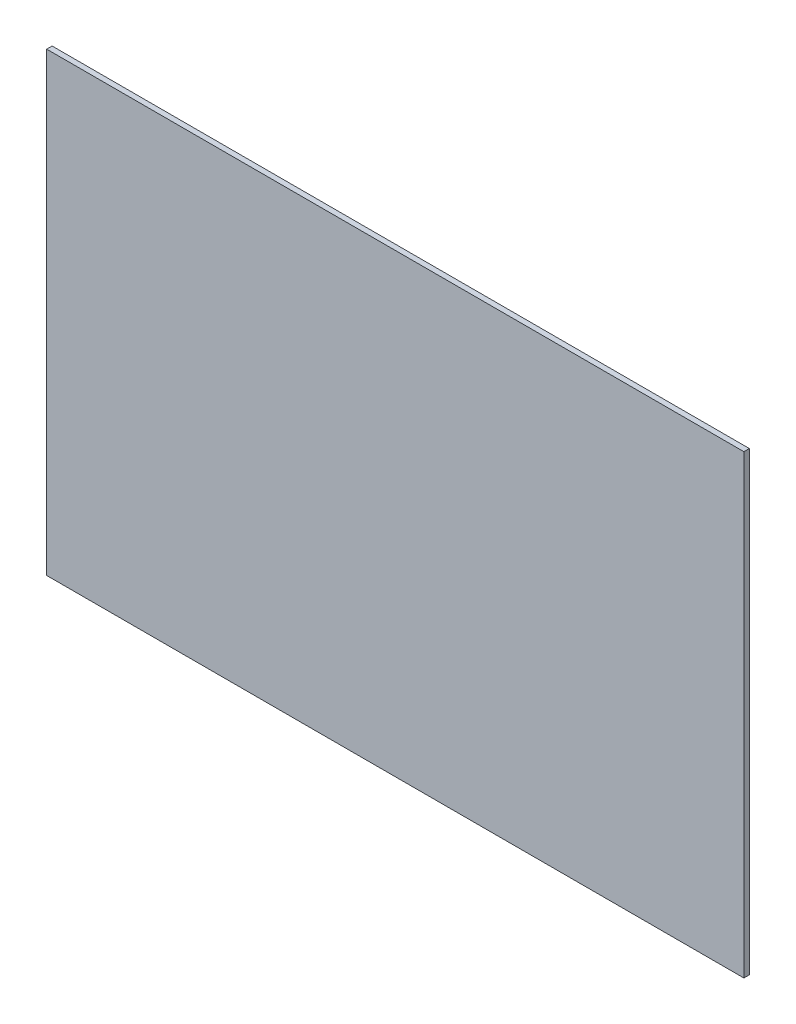
ISO-10303-21;
HEADER;
FILE_DESCRIPTION(('STEP AP214'),'2;1');
FILE_NAME('part.step','',(''),(''),'','','');
FILE_SCHEMA(('AUTOMOTIVE_DESIGN { 1 0 10303 214 1 1 1 1 }'));
ENDSEC;
DATA;
#1=APPLICATION_CONTEXT('core data for automotive mechanical design processes');
#2=APPLICATION_PROTOCOL_DEFINITION('international standard','automotive_design',2000,#1);
#3=PRODUCT_CONTEXT('',#1,'mechanical');
#4=PRODUCT('Part','Part','',(#3));
#5=PRODUCT_RELATED_PRODUCT_CATEGORY('part','',(#4));
#6=PRODUCT_DEFINITION_FORMATION('','',#4);
#7=PRODUCT_DEFINITION_CONTEXT('part definition',#1,'design');
#8=PRODUCT_DEFINITION('design','',#6,#7);
#9=PRODUCT_DEFINITION_SHAPE('','',#8);
#10=(LENGTH_UNIT() NAMED_UNIT(*) SI_UNIT(.MILLI.,.METRE.));
#11=(NAMED_UNIT(*) PLANE_ANGLE_UNIT() SI_UNIT($,.RADIAN.));
#12=(NAMED_UNIT(*) SI_UNIT($,.STERADIAN.) SOLID_ANGLE_UNIT());
#13=UNCERTAINTY_MEASURE_WITH_UNIT(LENGTH_MEASURE(1.E-05),#10,'distance_accuracy_value','');
#14=(GEOMETRIC_REPRESENTATION_CONTEXT(3) GLOBAL_UNCERTAINTY_ASSIGNED_CONTEXT((#13)) GLOBAL_UNIT_ASSIGNED_CONTEXT((#10,
#11,#12)) REPRESENTATION_CONTEXT('',''));
#15=CARTESIAN_POINT('',(0.,0.,0.));
#16=DIRECTION('',(0.,0.,1.));
#17=DIRECTION('',(1.,0.,0.));
#18=AXIS2_PLACEMENT_3D('',#15,#16,#17);
#19=CARTESIAN_POINT('',(416.,-272.,6.5));
#20=DIRECTION('',(-1.,0.,0.));
#21=DIRECTION('',(0.,0.,1.));
#22=AXIS2_PLACEMENT_3D('',#19,#20,#21);
#23=PLANE('',#22);
#24=DIRECTION('',(0.,1.,0.));
#25=VECTOR('',#24,1.);
#26=CARTESIAN_POINT('',(416.,-272.,0.));
#27=LINE('',#26,#25);
#28=CARTESIAN_POINT('',(416.,-272.,0.));
#29=VERTEX_POINT('',#28);
#30=CARTESIAN_POINT('',(416.,272.,0.));
#31=VERTEX_POINT('',#30);
#32=EDGE_CURVE('E96',#29,#31,#27,.T.);
#33=ORIENTED_EDGE('',*,*,#32,.T.);
#34=DIRECTION('',(0.,0.,-1.));
#35=VECTOR('',#34,1.);
#36=CARTESIAN_POINT('',(416.,272.,6.5));
#37=LINE('',#36,#35);
#38=CARTESIAN_POINT('',(416.,272.,6.5));
#39=VERTEX_POINT('',#38);
#40=EDGE_CURVE('E11',#39,#31,#37,.T.);
#41=ORIENTED_EDGE('',*,*,#40,.F.);
#42=DIRECTION('',(0.,1.,0.));
#43=VECTOR('',#42,1.);
#44=CARTESIAN_POINT('',(416.,-272.,6.5));
#45=LINE('',#44,#43);
#46=CARTESIAN_POINT('',(416.,-272.,6.5));
#47=VERTEX_POINT('',#46);
#48=EDGE_CURVE('E84',#47,#39,#45,.T.);
#49=ORIENTED_EDGE('',*,*,#48,.F.);
#50=DIRECTION('',(0.,0.,-1.));
#51=VECTOR('',#50,1.);
#52=CARTESIAN_POINT('',(416.,-272.,6.5));
#53=LINE('',#52,#51);
#54=EDGE_CURVE('E92',#47,#29,#53,.T.);
#55=ORIENTED_EDGE('',*,*,#54,.T.);
#56=EDGE_LOOP('',(#33,#41,#49,#55));
#57=FACE_BOUND('',#56,.T.);
#58=ADVANCED_FACE('F33',(#57),#23,.F.);
#59=CARTESIAN_POINT('',(-416.,272.,6.5));
#60=DIRECTION('',(0.,-1.,0.));
#61=DIRECTION('',(0.,0.,-1.));
#62=AXIS2_PLACEMENT_3D('',#59,#60,#61);
#63=PLANE('',#62);
#64=DIRECTION('',(-1.,0.,0.));
#65=VECTOR('',#64,1.);
#66=CARTESIAN_POINT('',(-416.,272.,0.));
#67=LINE('',#66,#65);
#68=CARTESIAN_POINT('',(-416.,272.,0.));
#69=VERTEX_POINT('',#68);
#70=EDGE_CURVE('E88',#31,#69,#67,.T.);
#71=ORIENTED_EDGE('',*,*,#70,.T.);
#72=DIRECTION('',(0.,0.,-1.));
#73=VECTOR('',#72,1.);
#74=CARTESIAN_POINT('',(-416.,272.,6.5));
#75=LINE('',#74,#73);
#76=CARTESIAN_POINT('',(-416.,272.,6.5));
#77=VERTEX_POINT('',#76);
#78=EDGE_CURVE('E41',#77,#69,#75,.T.);
#79=ORIENTED_EDGE('',*,*,#78,.F.);
#80=DIRECTION('',(-1.,0.,0.));
#81=VECTOR('',#80,1.);
#82=CARTESIAN_POINT('',(-416.,272.,6.5));
#83=LINE('',#82,#81);
#84=EDGE_CURVE('E79',#39,#77,#83,.T.);
#85=ORIENTED_EDGE('',*,*,#84,.F.);
#86=ORIENTED_EDGE('',*,*,#40,.T.);
#87=EDGE_LOOP('',(#71,#79,#85,#86));
#88=FACE_BOUND('',#87,.T.);
#89=ADVANCED_FACE('F87',(#88),#63,.F.);
#90=CARTESIAN_POINT('',(-416.,-272.,6.5));
#91=DIRECTION('',(1.,0.,0.));
#92=DIRECTION('',(0.,0.,-1.));
#93=AXIS2_PLACEMENT_3D('',#90,#91,#92);
#94=PLANE('',#93);
#95=DIRECTION('',(0.,-1.,0.));
#96=VECTOR('',#95,1.);
#97=CARTESIAN_POINT('',(-416.,-272.,0.));
#98=LINE('',#97,#96);
#99=CARTESIAN_POINT('',(-416.,-272.,0.));
#100=VERTEX_POINT('',#99);
#101=EDGE_CURVE('E66',#69,#100,#98,.T.);
#102=ORIENTED_EDGE('',*,*,#101,.T.);
#103=DIRECTION('',(0.,0.,-1.));
#104=VECTOR('',#103,1.);
#105=CARTESIAN_POINT('',(-416.,-272.,6.5));
#106=LINE('',#105,#104);
#107=CARTESIAN_POINT('',(-416.,-272.,6.5));
#108=VERTEX_POINT('',#107);
#109=EDGE_CURVE('E89',#108,#100,#106,.T.);
#110=ORIENTED_EDGE('',*,*,#109,.F.);
#111=DIRECTION('',(0.,-1.,0.));
#112=VECTOR('',#111,1.);
#113=CARTESIAN_POINT('',(-416.,-272.,6.5));
#114=LINE('',#113,#112);
#115=EDGE_CURVE('E82',#77,#108,#114,.T.);
#116=ORIENTED_EDGE('',*,*,#115,.F.);
#117=ORIENTED_EDGE('',*,*,#78,.T.);
#118=EDGE_LOOP('',(#102,#110,#116,#117));
#119=FACE_BOUND('',#118,.T.);
#120=ADVANCED_FACE('F90',(#119),#94,.F.);
#121=CARTESIAN_POINT('',(-416.,-272.,6.5));
#122=DIRECTION('',(0.,1.,0.));
#123=DIRECTION('',(0.,0.,1.));
#124=AXIS2_PLACEMENT_3D('',#121,#122,#123);
#125=PLANE('',#124);
#126=DIRECTION('',(1.,0.,0.));
#127=VECTOR('',#126,1.);
#128=CARTESIAN_POINT('',(-416.,-272.,0.));
#129=LINE('',#128,#127);
#130=EDGE_CURVE('E72',#100,#29,#129,.T.);
#131=ORIENTED_EDGE('',*,*,#130,.T.);
#132=ORIENTED_EDGE('',*,*,#54,.F.);
#133=DIRECTION('',(1.,0.,0.));
#134=VECTOR('',#133,1.);
#135=CARTESIAN_POINT('',(-416.,-272.,6.5));
#136=LINE('',#135,#134);
#137=EDGE_CURVE('E49',#108,#47,#136,.T.);
#138=ORIENTED_EDGE('',*,*,#137,.F.);
#139=ORIENTED_EDGE('',*,*,#109,.T.);
#140=EDGE_LOOP('',(#131,#132,#138,#139));
#141=FACE_BOUND('',#140,.T.);
#142=ADVANCED_FACE('F103',(#141),#125,.F.);
#143=CARTESIAN_POINT('',(0.,0.,6.5));
#144=DIRECTION('',(0.,0.,-1.));
#145=DIRECTION('',(-1.,0.,0.));
#146=AXIS2_PLACEMENT_3D('',#143,#144,#145);
#147=PLANE('',#146);
#148=ORIENTED_EDGE('',*,*,#48,.T.);
#149=ORIENTED_EDGE('',*,*,#84,.T.);
#150=ORIENTED_EDGE('',*,*,#115,.T.);
#151=ORIENTED_EDGE('',*,*,#137,.T.);
#152=EDGE_LOOP('',(#148,#149,#150,#151));
#153=FACE_BOUND('',#152,.T.);
#154=ADVANCED_FACE('F80',(#153),#147,.F.);
#155=CARTESIAN_POINT('',(0.,0.,0.));
#156=DIRECTION('',(0.,0.,-1.));
#157=DIRECTION('',(-1.,0.,0.));
#158=AXIS2_PLACEMENT_3D('',#155,#156,#157);
#159=PLANE('',#158);
#160=ORIENTED_EDGE('',*,*,#32,.F.);
#161=ORIENTED_EDGE('',*,*,#130,.F.);
#162=ORIENTED_EDGE('',*,*,#101,.F.);
#163=ORIENTED_EDGE('',*,*,#70,.F.);
#164=EDGE_LOOP('',(#160,#161,#162,#163));
#165=FACE_BOUND('',#164,.T.);
#166=ADVANCED_FACE('F106',(#165),#159,.T.);
#167=CLOSED_SHELL('',(#58,#89,#120,#142,#154,#166));
#168=MANIFOLD_SOLID_BREP('B2',#167);
#169=ADVANCED_BREP_SHAPE_REPRESENTATION('',(#18,#168),#14);
#170=SHAPE_DEFINITION_REPRESENTATION(#9,#169);
ENDSEC;
END-ISO-10303-21;
